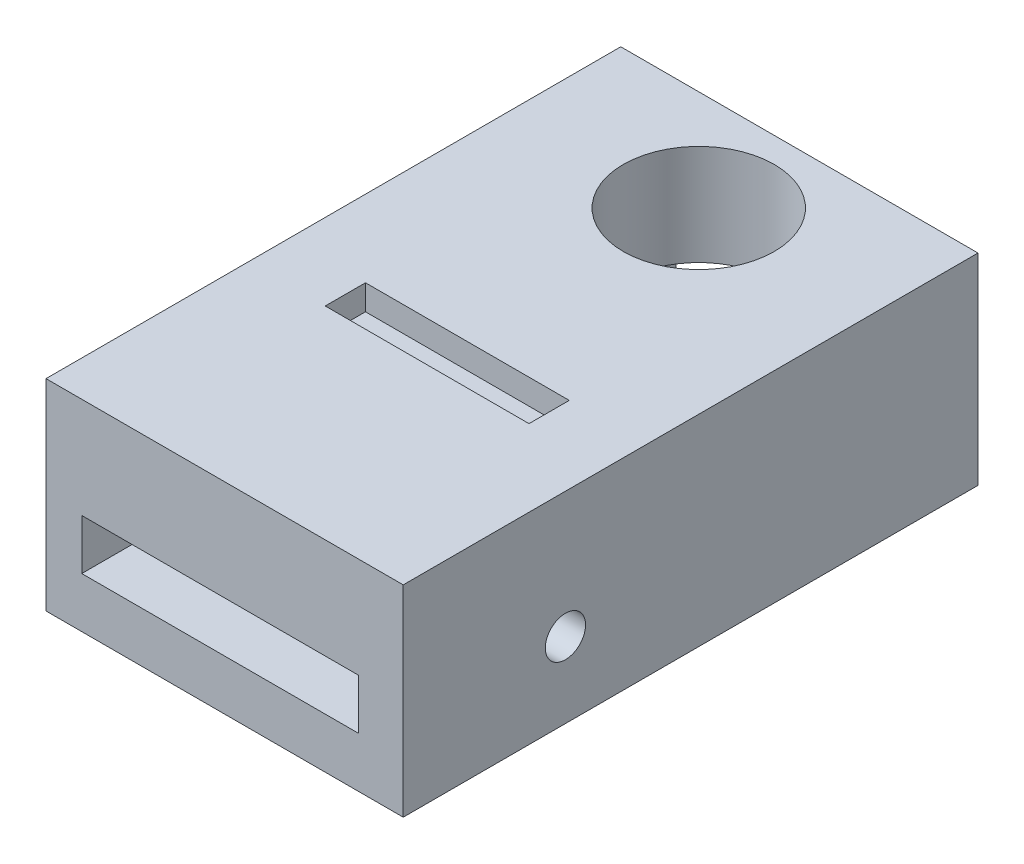
ISO-10303-21;
HEADER;
FILE_DESCRIPTION(('STEP AP214'),'2;1');
FILE_NAME('part.step','',(''),(''),'','','');
FILE_SCHEMA(('AUTOMOTIVE_DESIGN { 1 0 10303 214 1 1 1 1 }'));
ENDSEC;
DATA;
#1=APPLICATION_CONTEXT('core data for automotive mechanical design processes');
#2=APPLICATION_PROTOCOL_DEFINITION('international standard','automotive_design',2000,#1);
#3=PRODUCT_CONTEXT('',#1,'mechanical');
#4=PRODUCT('Part','Part','',(#3));
#5=PRODUCT_RELATED_PRODUCT_CATEGORY('part','',(#4));
#6=PRODUCT_DEFINITION_FORMATION('','',#4);
#7=PRODUCT_DEFINITION_CONTEXT('part definition',#1,'design');
#8=PRODUCT_DEFINITION('design','',#6,#7);
#9=PRODUCT_DEFINITION_SHAPE('','',#8);
#10=(LENGTH_UNIT() NAMED_UNIT(*) SI_UNIT(.MILLI.,.METRE.));
#11=(NAMED_UNIT(*) PLANE_ANGLE_UNIT() SI_UNIT($,.RADIAN.));
#12=(NAMED_UNIT(*) SI_UNIT($,.STERADIAN.) SOLID_ANGLE_UNIT());
#13=UNCERTAINTY_MEASURE_WITH_UNIT(LENGTH_MEASURE(1.E-05),#10,'distance_accuracy_value','');
#14=(GEOMETRIC_REPRESENTATION_CONTEXT(3) GLOBAL_UNCERTAINTY_ASSIGNED_CONTEXT((#13)) GLOBAL_UNIT_ASSIGNED_CONTEXT((#10,
#11,#12)) REPRESENTATION_CONTEXT('',''));
#15=CARTESIAN_POINT('',(0.,0.,0.));
#16=DIRECTION('',(0.,0.,1.));
#17=DIRECTION('',(1.,0.,0.));
#18=AXIS2_PLACEMENT_3D('',#15,#16,#17);
#19=CARTESIAN_POINT('',(35.5,40.,32.12));
#20=DIRECTION('',(-1.,0.,0.));
#21=DIRECTION('',(0.,0.,1.));
#22=AXIS2_PLACEMENT_3D('',#19,#20,#21);
#23=PLANE('',#22);
#24=CARTESIAN_POINT('',(35.5,15.,-0.120000000000009));
#25=DIRECTION('',(1.,0.,0.));
#26=DIRECTION('',(0.,0.,-1.));
#27=AXIS2_PLACEMENT_3D('',#24,#25,#26);
#28=CIRCLE('',#27,4.);
#29=CARTESIAN_POINT('',(35.5,15.,-4.12000000000001));
#30=VERTEX_POINT('',#29);
#31=EDGE_CURVE('E223',#30,#30,#28,.T.);
#32=ORIENTED_EDGE('',*,*,#31,.F.);
#33=EDGE_LOOP('',(#32));
#34=FACE_BOUND('',#33,.T.);
#35=DIRECTION('',(0.,0.,-1.));
#36=VECTOR('',#35,1.);
#37=CARTESIAN_POINT('',(35.5,0.,32.12));
#38=LINE('',#37,#36);
#39=CARTESIAN_POINT('',(35.5,0.,32.12));
#40=VERTEX_POINT('',#39);
#41=CARTESIAN_POINT('',(35.5,0.,-82.12));
#42=VERTEX_POINT('',#41);
#43=EDGE_CURVE('E277',#40,#42,#38,.T.);
#44=ORIENTED_EDGE('',*,*,#43,.T.);
#45=DIRECTION('',(0.,-1.,0.));
#46=VECTOR('',#45,1.);
#47=CARTESIAN_POINT('',(35.5,40.,-82.12));
#48=LINE('',#47,#46);
#49=CARTESIAN_POINT('',(35.5,40.,-82.12));
#50=VERTEX_POINT('',#49);
#51=EDGE_CURVE('E261',#50,#42,#48,.T.);
#52=ORIENTED_EDGE('',*,*,#51,.F.);
#53=DIRECTION('',(0.,0.,-1.));
#54=VECTOR('',#53,1.);
#55=CARTESIAN_POINT('',(35.5,40.,32.12));
#56=LINE('',#55,#54);
#57=CARTESIAN_POINT('',(35.5,40.,32.12));
#58=VERTEX_POINT('',#57);
#59=EDGE_CURVE('E278',#58,#50,#56,.T.);
#60=ORIENTED_EDGE('',*,*,#59,.F.);
#61=DIRECTION('',(0.,-1.,0.));
#62=VECTOR('',#61,1.);
#63=CARTESIAN_POINT('',(35.5,40.,32.12));
#64=LINE('',#63,#62);
#65=EDGE_CURVE('E41',#58,#40,#64,.T.);
#66=ORIENTED_EDGE('',*,*,#65,.T.);
#67=EDGE_LOOP('',(#44,#52,#60,#66));
#68=FACE_BOUND('',#67,.T.);
#69=ADVANCED_FACE('F33',(#34,#68),#23,.F.);
#70=CARTESIAN_POINT('',(-35.5,40.,32.12));
#71=DIRECTION('',(1.,0.,0.));
#72=DIRECTION('',(0.,0.,-1.));
#73=AXIS2_PLACEMENT_3D('',#70,#71,#72);
#74=PLANE('',#73);
#75=CARTESIAN_POINT('',(-35.5,15.,-0.119999999999995));
#76=DIRECTION('',(-1.,0.,0.));
#77=DIRECTION('',(0.,0.,1.));
#78=AXIS2_PLACEMENT_3D('',#75,#76,#77);
#79=CIRCLE('',#78,4.);
#80=CARTESIAN_POINT('',(-35.5,15.,3.88000000000001));
#81=VERTEX_POINT('',#80);
#82=EDGE_CURVE('E274',#81,#81,#79,.T.);
#83=ORIENTED_EDGE('',*,*,#82,.F.);
#84=EDGE_LOOP('',(#83));
#85=FACE_BOUND('',#84,.T.);
#86=DIRECTION('',(0.,0.,1.));
#87=VECTOR('',#86,1.);
#88=CARTESIAN_POINT('',(-35.5,0.,32.12));
#89=LINE('',#88,#87);
#90=CARTESIAN_POINT('',(-35.5,0.,-82.12));
#91=VERTEX_POINT('',#90);
#92=CARTESIAN_POINT('',(-35.5,0.,32.12));
#93=VERTEX_POINT('',#92);
#94=EDGE_CURVE('E286',#91,#93,#89,.T.);
#95=ORIENTED_EDGE('',*,*,#94,.T.);
#96=DIRECTION('',(0.,-1.,0.));
#97=VECTOR('',#96,1.);
#98=CARTESIAN_POINT('',(-35.5,40.,32.12));
#99=LINE('',#98,#97);
#100=CARTESIAN_POINT('',(-35.5,40.,32.12));
#101=VERTEX_POINT('',#100);
#102=EDGE_CURVE('E11',#101,#93,#99,.T.);
#103=ORIENTED_EDGE('',*,*,#102,.F.);
#104=DIRECTION('',(0.,0.,1.));
#105=VECTOR('',#104,1.);
#106=CARTESIAN_POINT('',(-35.5,40.,32.12));
#107=LINE('',#106,#105);
#108=CARTESIAN_POINT('',(-35.5,40.,-82.12));
#109=VERTEX_POINT('',#108);
#110=EDGE_CURVE('E280',#109,#101,#107,.T.);
#111=ORIENTED_EDGE('',*,*,#110,.F.);
#112=DIRECTION('',(0.,1.,0.));
#113=VECTOR('',#112,1.);
#114=CARTESIAN_POINT('',(-35.5,40.,-82.12));
#115=LINE('',#114,#113);
#116=EDGE_CURVE('E268',#91,#109,#115,.T.);
#117=ORIENTED_EDGE('',*,*,#116,.F.);
#118=EDGE_LOOP('',(#95,#103,#111,#117));
#119=FACE_BOUND('',#118,.T.);
#120=ADVANCED_FACE('F315',(#85,#119),#74,.F.);
#121=CARTESIAN_POINT('',(-35.5,40.,32.12));
#122=DIRECTION('',(0.,0.,-1.));
#123=DIRECTION('',(-1.,0.,0.));
#124=AXIS2_PLACEMENT_3D('',#121,#122,#123);
#125=PLANE('',#124);
#126=DIRECTION('',(-1.,0.,0.));
#127=VECTOR('',#126,1.);
#128=CARTESIAN_POINT('',(-28.3908256360522,20.,32.12));
#129=LINE('',#128,#127);
#130=CARTESIAN_POINT('',(26.6091743639478,20.,32.12));
#131=VERTEX_POINT('',#130);
#132=CARTESIAN_POINT('',(-28.3908256360522,20.,32.12));
#133=VERTEX_POINT('',#132);
#134=EDGE_CURVE('E202',#131,#133,#129,.T.);
#135=ORIENTED_EDGE('',*,*,#134,.F.);
#136=DIRECTION('',(0.,1.,0.));
#137=VECTOR('',#136,1.);
#138=CARTESIAN_POINT('',(26.6091743639478,10.,32.12));
#139=LINE('',#138,#137);
#140=CARTESIAN_POINT('',(26.6091743639478,10.,32.12));
#141=VERTEX_POINT('',#140);
#142=EDGE_CURVE('E57',#141,#131,#139,.T.);
#143=ORIENTED_EDGE('',*,*,#142,.F.);
#144=DIRECTION('',(1.,0.,0.));
#145=VECTOR('',#144,1.);
#146=CARTESIAN_POINT('',(-28.3908256360522,10.,32.12));
#147=LINE('',#146,#145);
#148=CARTESIAN_POINT('',(-28.3908256360522,10.,32.12));
#149=VERTEX_POINT('',#148);
#150=EDGE_CURVE('E191',#149,#141,#147,.T.);
#151=ORIENTED_EDGE('',*,*,#150,.F.);
#152=DIRECTION('',(0.,-1.,0.));
#153=VECTOR('',#152,1.);
#154=CARTESIAN_POINT('',(-28.3908256360522,10.,32.12));
#155=LINE('',#154,#153);
#156=EDGE_CURVE('E205',#133,#149,#155,.T.);
#157=ORIENTED_EDGE('',*,*,#156,.F.);
#158=EDGE_LOOP('',(#135,#143,#151,#157));
#159=FACE_BOUND('',#158,.T.);
#160=DIRECTION('',(1.,0.,0.));
#161=VECTOR('',#160,1.);
#162=CARTESIAN_POINT('',(-35.5,0.,32.12));
#163=LINE('',#162,#161);
#164=EDGE_CURVE('E281',#93,#40,#163,.T.);
#165=ORIENTED_EDGE('',*,*,#164,.T.);
#166=ORIENTED_EDGE('',*,*,#65,.F.);
#167=DIRECTION('',(1.,0.,0.));
#168=VECTOR('',#167,1.);
#169=CARTESIAN_POINT('',(-35.5,40.,32.12));
#170=LINE('',#169,#168);
#171=EDGE_CURVE('E283',#101,#58,#170,.T.);
#172=ORIENTED_EDGE('',*,*,#171,.F.);
#173=ORIENTED_EDGE('',*,*,#102,.T.);
#174=EDGE_LOOP('',(#165,#166,#172,#173));
#175=FACE_BOUND('',#174,.T.);
#176=ADVANCED_FACE('F320',(#159,#175),#125,.F.);
#177=CARTESIAN_POINT('',(0.,40.,0.));
#178=DIRECTION('',(0.,-1.,0.));
#179=DIRECTION('',(0.,0.,-1.));
#180=AXIS2_PLACEMENT_3D('',#177,#178,#179);
#181=PLANE('',#180);
#182=DIRECTION('',(1.,0.,0.));
#183=VECTOR('',#182,1.);
#184=CARTESIAN_POINT('',(-20.25,40.,-8.13));
#185=LINE('',#184,#183);
#186=CARTESIAN_POINT('',(-20.25,40.,-8.13));
#187=VERTEX_POINT('',#186);
#188=CARTESIAN_POINT('',(20.25,40.,-8.13));
#189=VERTEX_POINT('',#188);
#190=EDGE_CURVE('E242',#187,#189,#185,.T.);
#191=ORIENTED_EDGE('',*,*,#190,.F.);
#192=DIRECTION('',(0.,0.,1.));
#193=VECTOR('',#192,1.);
#194=CARTESIAN_POINT('',(-20.25,40.,-16.13));
#195=LINE('',#194,#193);
#196=CARTESIAN_POINT('',(-20.25,40.,-16.13));
#197=VERTEX_POINT('',#196);
#198=EDGE_CURVE('E226',#197,#187,#195,.T.);
#199=ORIENTED_EDGE('',*,*,#198,.F.);
#200=DIRECTION('',(-1.,0.,0.));
#201=VECTOR('',#200,1.);
#202=CARTESIAN_POINT('',(-20.25,40.,-16.13));
#203=LINE('',#202,#201);
#204=CARTESIAN_POINT('',(20.25,40.,-16.13));
#205=VERTEX_POINT('',#204);
#206=EDGE_CURVE('E231',#205,#197,#203,.T.);
#207=ORIENTED_EDGE('',*,*,#206,.F.);
#208=DIRECTION('',(0.,0.,-1.));
#209=VECTOR('',#208,1.);
#210=CARTESIAN_POINT('',(20.25,40.,-16.13));
#211=LINE('',#210,#209);
#212=EDGE_CURVE('E245',#189,#205,#211,.T.);
#213=ORIENTED_EDGE('',*,*,#212,.F.);
#214=EDGE_LOOP('',(#191,#199,#207,#213));
#215=FACE_BOUND('',#214,.T.);
#216=CARTESIAN_POINT('',(0.,40.,-62.12));
#217=DIRECTION('',(0.,1.,0.));
#218=DIRECTION('',(0.,0.,1.));
#219=AXIS2_PLACEMENT_3D('',#216,#217,#218);
#220=CIRCLE('',#219,15.);
#221=CARTESIAN_POINT('',(0.,40.,-47.12));
#222=VERTEX_POINT('',#221);
#223=EDGE_CURVE('E252',#222,#222,#220,.T.);
#224=ORIENTED_EDGE('',*,*,#223,.F.);
#225=EDGE_LOOP('',(#224));
#226=FACE_BOUND('',#225,.T.);
#227=ORIENTED_EDGE('',*,*,#59,.T.);
#228=DIRECTION('',(1.,0.,0.));
#229=VECTOR('',#228,1.);
#230=CARTESIAN_POINT('',(35.5,40.,-82.12));
#231=LINE('',#230,#229);
#232=EDGE_CURVE('E271',#109,#50,#231,.T.);
#233=ORIENTED_EDGE('',*,*,#232,.F.);
#234=ORIENTED_EDGE('',*,*,#110,.T.);
#235=ORIENTED_EDGE('',*,*,#171,.T.);
#236=EDGE_LOOP('',(#227,#233,#234,#235));
#237=FACE_BOUND('',#236,.T.);
#238=ADVANCED_FACE('F337',(#215,#226,#237),#181,.F.);
#239=CARTESIAN_POINT('',(0.,0.,0.));
#240=DIRECTION('',(0.,-1.,0.));
#241=DIRECTION('',(0.,0.,-1.));
#242=AXIS2_PLACEMENT_3D('',#239,#240,#241);
#243=PLANE('',#242);
#244=DIRECTION('',(0.,0.,1.));
#245=VECTOR('',#244,1.);
#246=CARTESIAN_POINT('',(26.61,0.,-82.12));
#247=LINE('',#246,#245);
#248=CARTESIAN_POINT('',(26.61,0.,-82.12));
#249=VERTEX_POINT('',#248);
#250=CARTESIAN_POINT('',(26.61,0.,-44.12));
#251=VERTEX_POINT('',#250);
#252=EDGE_CURVE('E156',#249,#251,#247,.T.);
#253=ORIENTED_EDGE('',*,*,#252,.F.);
#254=DIRECTION('',(-1.,0.,0.));
#255=VECTOR('',#254,1.);
#256=CARTESIAN_POINT('',(35.5,0.,-82.12));
#257=LINE('',#256,#255);
#258=EDGE_CURVE('E265',#42,#249,#257,.T.);
#259=ORIENTED_EDGE('',*,*,#258,.F.);
#260=ORIENTED_EDGE('',*,*,#43,.F.);
#261=ORIENTED_EDGE('',*,*,#164,.F.);
#262=ORIENTED_EDGE('',*,*,#94,.F.);
#263=CARTESIAN_POINT('',(-24.5,0.,-82.12));
#264=VERTEX_POINT('',#263);
#265=EDGE_CURVE('E264',#264,#91,#257,.T.);
#266=ORIENTED_EDGE('',*,*,#265,.F.);
#267=DIRECTION('',(0.,0.,-1.));
#268=VECTOR('',#267,1.);
#269=CARTESIAN_POINT('',(-24.5,0.,-82.12));
#270=LINE('',#269,#268);
#271=CARTESIAN_POINT('',(-24.5,0.,-44.12));
#272=VERTEX_POINT('',#271);
#273=EDGE_CURVE('E171',#272,#264,#270,.T.);
#274=ORIENTED_EDGE('',*,*,#273,.F.);
#275=DIRECTION('',(-1.,0.,0.));
#276=VECTOR('',#275,1.);
#277=CARTESIAN_POINT('',(26.61,0.,-44.12));
#278=LINE('',#277,#276);
#279=EDGE_CURVE('E173',#251,#272,#278,.T.);
#280=ORIENTED_EDGE('',*,*,#279,.F.);
#281=EDGE_LOOP('',(#253,#259,#260,#261,#262,#266,#274,#280));
#282=FACE_BOUND('',#281,.T.);
#283=ADVANCED_FACE('F331',(#282),#243,.T.);
#284=CARTESIAN_POINT('',(-25.5,15.,-0.119999999999995));
#285=DIRECTION('',(-1.,0.,0.));
#286=DIRECTION('',(0.,0.,1.));
#287=AXIS2_PLACEMENT_3D('',#284,#285,#286);
#288=CYLINDRICAL_SURFACE('',#287,4.);
#289=CARTESIAN_POINT('',(-28.3908256360522,15.,-0.119999999999995));
#290=DIRECTION('',(-1.,0.,0.));
#291=DIRECTION('',(0.,0.,1.));
#292=AXIS2_PLACEMENT_3D('',#289,#290,#291);
#293=CIRCLE('',#292,4.);
#294=CARTESIAN_POINT('',(-28.3908256360522,15.,3.88000000000001));
#295=VERTEX_POINT('',#294);
#296=EDGE_CURVE('E220',#295,#295,#293,.F.);
#297=ORIENTED_EDGE('',*,*,#296,.T.);
#298=EDGE_LOOP('',(#297));
#299=FACE_BOUND('',#298,.T.);
#300=ORIENTED_EDGE('',*,*,#82,.T.);
#301=EDGE_LOOP('',(#300));
#302=FACE_BOUND('',#301,.T.);
#303=ADVANCED_FACE('F368',(#299,#302),#288,.F.);
#304=CARTESIAN_POINT('',(0.,0.,-82.12));
#305=DIRECTION('',(0.,0.,-1.));
#306=DIRECTION('',(-1.,0.,0.));
#307=AXIS2_PLACEMENT_3D('',#304,#305,#306);
#308=PLANE('',#307);
#309=DIRECTION('',(0.,-1.,0.));
#310=VECTOR('',#309,1.);
#311=CARTESIAN_POINT('',(-24.5,10.,-82.12));
#312=LINE('',#311,#310);
#313=CARTESIAN_POINT('',(-24.5,10.,-82.12));
#314=VERTEX_POINT('',#313);
#315=EDGE_CURVE('E183',#314,#264,#312,.T.);
#316=ORIENTED_EDGE('',*,*,#315,.T.);
#317=ORIENTED_EDGE('',*,*,#265,.T.);
#318=ORIENTED_EDGE('',*,*,#116,.T.);
#319=ORIENTED_EDGE('',*,*,#232,.T.);
#320=ORIENTED_EDGE('',*,*,#51,.T.);
#321=ORIENTED_EDGE('',*,*,#258,.T.);
#322=DIRECTION('',(0.,-1.,0.));
#323=VECTOR('',#322,1.);
#324=CARTESIAN_POINT('',(26.61,10.,-82.12));
#325=LINE('',#324,#323);
#326=CARTESIAN_POINT('',(26.61,10.,-82.12));
#327=VERTEX_POINT('',#326);
#328=EDGE_CURVE('E181',#327,#249,#325,.T.);
#329=ORIENTED_EDGE('',*,*,#328,.F.);
#330=DIRECTION('',(1.,0.,0.));
#331=VECTOR('',#330,1.);
#332=CARTESIAN_POINT('',(26.61,10.,-82.12));
#333=LINE('',#332,#331);
#334=CARTESIAN_POINT('',(26.6091743639478,10.,-82.12));
#335=VERTEX_POINT('',#334);
#336=EDGE_CURVE('E161',#335,#327,#333,.T.);
#337=ORIENTED_EDGE('',*,*,#336,.F.);
#338=DIRECTION('',(0.,1.,0.));
#339=VECTOR('',#338,1.);
#340=CARTESIAN_POINT('',(26.6091743639478,10.,-82.12));
#341=LINE('',#340,#339);
#342=CARTESIAN_POINT('',(26.6091743639478,20.,-82.12));
#343=VERTEX_POINT('',#342);
#344=EDGE_CURVE('E187',#335,#343,#341,.T.);
#345=ORIENTED_EDGE('',*,*,#344,.T.);
#346=DIRECTION('',(-1.,0.,0.));
#347=VECTOR('',#346,1.);
#348=CARTESIAN_POINT('',(-28.3908256360522,20.,-82.12));
#349=LINE('',#348,#347);
#350=CARTESIAN_POINT('',(-28.3908256360522,20.,-82.12));
#351=VERTEX_POINT('',#350);
#352=EDGE_CURVE('E190',#343,#351,#349,.T.);
#353=ORIENTED_EDGE('',*,*,#352,.T.);
#354=DIRECTION('',(0.,-1.,0.));
#355=VECTOR('',#354,1.);
#356=CARTESIAN_POINT('',(-28.3908256360522,10.,-82.12));
#357=LINE('',#356,#355);
#358=CARTESIAN_POINT('',(-28.3908256360522,10.,-82.12));
#359=VERTEX_POINT('',#358);
#360=EDGE_CURVE('E194',#351,#359,#357,.T.);
#361=ORIENTED_EDGE('',*,*,#360,.T.);
#362=DIRECTION('',(1.,0.,0.));
#363=VECTOR('',#362,1.);
#364=CARTESIAN_POINT('',(-28.3908256360522,10.,-82.12));
#365=LINE('',#364,#363);
#366=EDGE_CURVE('E197',#359,#314,#365,.T.);
#367=ORIENTED_EDGE('',*,*,#366,.T.);
#368=EDGE_LOOP('',(#316,#317,#318,#319,#320,#321,#329,#337,#345,#353,#361,#367));
#369=FACE_BOUND('',#368,.T.);
#370=ADVANCED_FACE('F333',(#369),#308,.T.);
#371=CARTESIAN_POINT('',(0.,0.,-62.12));
#372=DIRECTION('',(0.,1.,0.));
#373=DIRECTION('',(0.,0.,1.));
#374=AXIS2_PLACEMENT_3D('',#371,#372,#373);
#375=CYLINDRICAL_SURFACE('',#374,15.);
#376=CARTESIAN_POINT('',(0.,20.,-62.12));
#377=DIRECTION('',(0.,1.,0.));
#378=DIRECTION('',(0.,0.,1.));
#379=AXIS2_PLACEMENT_3D('',#376,#377,#378);
#380=CIRCLE('',#379,15.);
#381=CARTESIAN_POINT('',(0.,20.,-47.12));
#382=VERTEX_POINT('',#381);
#383=EDGE_CURVE('E36',#382,#382,#380,.F.);
#384=ORIENTED_EDGE('',*,*,#383,.T.);
#385=EDGE_LOOP('',(#384));
#386=FACE_BOUND('',#385,.T.);
#387=ORIENTED_EDGE('',*,*,#223,.T.);
#388=EDGE_LOOP('',(#387));
#389=FACE_BOUND('',#388,.T.);
#390=ADVANCED_FACE('F296',(#386,#389),#375,.F.);
#391=CARTESIAN_POINT('',(-20.25,35.,-16.13));
#392=DIRECTION('',(-1.,0.,0.));
#393=DIRECTION('',(0.,0.,1.));
#394=AXIS2_PLACEMENT_3D('',#391,#392,#393);
#395=PLANE('',#394);
#396=ORIENTED_EDGE('',*,*,#198,.T.);
#397=DIRECTION('',(0.,1.,0.));
#398=VECTOR('',#397,1.);
#399=CARTESIAN_POINT('',(-20.25,35.,-8.13));
#400=LINE('',#399,#398);
#401=CARTESIAN_POINT('',(-20.25,35.,-8.13));
#402=VERTEX_POINT('',#401);
#403=EDGE_CURVE('E240',#402,#187,#400,.T.);
#404=ORIENTED_EDGE('',*,*,#403,.F.);
#405=DIRECTION('',(0.,0.,1.));
#406=VECTOR('',#405,1.);
#407=CARTESIAN_POINT('',(-20.25,35.,-16.13));
#408=LINE('',#407,#406);
#409=CARTESIAN_POINT('',(-20.25,35.,-16.13));
#410=VERTEX_POINT('',#409);
#411=EDGE_CURVE('E227',#410,#402,#408,.T.);
#412=ORIENTED_EDGE('',*,*,#411,.F.);
#413=DIRECTION('',(0.,1.,0.));
#414=VECTOR('',#413,1.);
#415=CARTESIAN_POINT('',(-20.25,35.,-16.13));
#416=LINE('',#415,#414);
#417=EDGE_CURVE('E250',#410,#197,#416,.T.);
#418=ORIENTED_EDGE('',*,*,#417,.T.);
#419=EDGE_LOOP('',(#396,#404,#412,#418));
#420=FACE_BOUND('',#419,.T.);
#421=ADVANCED_FACE('F377',(#420),#395,.F.);
#422=CARTESIAN_POINT('',(-20.25,35.,-16.13));
#423=DIRECTION('',(0.,0.,-1.));
#424=DIRECTION('',(-1.,0.,0.));
#425=AXIS2_PLACEMENT_3D('',#422,#423,#424);
#426=PLANE('',#425);
#427=ORIENTED_EDGE('',*,*,#206,.T.);
#428=ORIENTED_EDGE('',*,*,#417,.F.);
#429=DIRECTION('',(-1.,0.,0.));
#430=VECTOR('',#429,1.);
#431=CARTESIAN_POINT('',(-20.25,35.,-16.13));
#432=LINE('',#431,#430);
#433=CARTESIAN_POINT('',(20.25,35.,-16.13));
#434=VERTEX_POINT('',#433);
#435=EDGE_CURVE('E237',#434,#410,#432,.T.);
#436=ORIENTED_EDGE('',*,*,#435,.F.);
#437=DIRECTION('',(0.,1.,0.));
#438=VECTOR('',#437,1.);
#439=CARTESIAN_POINT('',(20.25,35.,-16.13));
#440=LINE('',#439,#438);
#441=EDGE_CURVE('E253',#434,#205,#440,.T.);
#442=ORIENTED_EDGE('',*,*,#441,.T.);
#443=EDGE_LOOP('',(#427,#428,#436,#442));
#444=FACE_BOUND('',#443,.T.);
#445=ADVANCED_FACE('F380',(#444),#426,.F.);
#446=CARTESIAN_POINT('',(20.25,35.,-16.13));
#447=DIRECTION('',(1.,0.,0.));
#448=DIRECTION('',(0.,0.,-1.));
#449=AXIS2_PLACEMENT_3D('',#446,#447,#448);
#450=PLANE('',#449);
#451=ORIENTED_EDGE('',*,*,#212,.T.);
#452=ORIENTED_EDGE('',*,*,#441,.F.);
#453=DIRECTION('',(0.,0.,-1.));
#454=VECTOR('',#453,1.);
#455=CARTESIAN_POINT('',(20.25,35.,-16.13));
#456=LINE('',#455,#454);
#457=CARTESIAN_POINT('',(20.25,35.,-8.13));
#458=VERTEX_POINT('',#457);
#459=EDGE_CURVE('E234',#458,#434,#456,.T.);
#460=ORIENTED_EDGE('',*,*,#459,.F.);
#461=DIRECTION('',(0.,1.,0.));
#462=VECTOR('',#461,1.);
#463=CARTESIAN_POINT('',(20.25,35.,-8.13));
#464=LINE('',#463,#462);
#465=EDGE_CURVE('E255',#458,#189,#464,.T.);
#466=ORIENTED_EDGE('',*,*,#465,.T.);
#467=EDGE_LOOP('',(#451,#452,#460,#466));
#468=FACE_BOUND('',#467,.T.);
#469=ADVANCED_FACE('F386',(#468),#450,.F.);
#470=CARTESIAN_POINT('',(-20.25,35.,-8.13));
#471=DIRECTION('',(0.,0.,1.));
#472=DIRECTION('',(1.,0.,0.));
#473=AXIS2_PLACEMENT_3D('',#470,#471,#472);
#474=PLANE('',#473);
#475=ORIENTED_EDGE('',*,*,#190,.T.);
#476=ORIENTED_EDGE('',*,*,#465,.F.);
#477=DIRECTION('',(1.,0.,0.));
#478=VECTOR('',#477,1.);
#479=CARTESIAN_POINT('',(-20.25,35.,-8.13));
#480=LINE('',#479,#478);
#481=EDGE_CURVE('E230',#402,#458,#480,.T.);
#482=ORIENTED_EDGE('',*,*,#481,.F.);
#483=ORIENTED_EDGE('',*,*,#403,.T.);
#484=EDGE_LOOP('',(#475,#476,#482,#483));
#485=FACE_BOUND('',#484,.T.);
#486=ADVANCED_FACE('F382',(#485),#474,.F.);
#487=CARTESIAN_POINT('',(0.,35.,0.));
#488=DIRECTION('',(0.,1.,0.));
#489=DIRECTION('',(0.,0.,1.));
#490=AXIS2_PLACEMENT_3D('',#487,#488,#489);
#491=PLANE('',#490);
#492=ORIENTED_EDGE('',*,*,#411,.T.);
#493=ORIENTED_EDGE('',*,*,#481,.T.);
#494=ORIENTED_EDGE('',*,*,#459,.T.);
#495=ORIENTED_EDGE('',*,*,#435,.T.);
#496=EDGE_LOOP('',(#492,#493,#494,#495));
#497=FACE_BOUND('',#496,.T.);
#498=ADVANCED_FACE('F385',(#497),#491,.T.);
#499=CARTESIAN_POINT('',(25.5,15.,-0.120000000000009));
#500=DIRECTION('',(1.,0.,0.));
#501=DIRECTION('',(0.,0.,-1.));
#502=AXIS2_PLACEMENT_3D('',#499,#500,#501);
#503=CYLINDRICAL_SURFACE('',#502,4.);
#504=CARTESIAN_POINT('',(26.6091743639478,15.,-0.120000000000009));
#505=DIRECTION('',(1.,0.,0.));
#506=DIRECTION('',(0.,0.,-1.));
#507=AXIS2_PLACEMENT_3D('',#504,#505,#506);
#508=CIRCLE('',#507,4.);
#509=CARTESIAN_POINT('',(26.6091743639478,15.,-4.12000000000001));
#510=VERTEX_POINT('',#509);
#511=EDGE_CURVE('E213',#510,#510,#508,.F.);
#512=ORIENTED_EDGE('',*,*,#511,.T.);
#513=EDGE_LOOP('',(#512));
#514=FACE_BOUND('',#513,.T.);
#515=ORIENTED_EDGE('',*,*,#31,.T.);
#516=EDGE_LOOP('',(#515));
#517=FACE_BOUND('',#516,.T.);
#518=ADVANCED_FACE('F396',(#514,#517),#503,.F.);
#519=CARTESIAN_POINT('',(-28.3908256360522,10.,-82.12));
#520=DIRECTION('',(-1.,0.,0.));
#521=DIRECTION('',(0.,0.,1.));
#522=AXIS2_PLACEMENT_3D('',#519,#520,#521);
#523=PLANE('',#522);
#524=ORIENTED_EDGE('',*,*,#156,.T.);
#525=DIRECTION('',(0.,0.,1.));
#526=VECTOR('',#525,1.);
#527=CARTESIAN_POINT('',(-28.3908256360522,10.,-82.12));
#528=LINE('',#527,#526);
#529=EDGE_CURVE('E215',#359,#149,#528,.T.);
#530=ORIENTED_EDGE('',*,*,#529,.F.);
#531=ORIENTED_EDGE('',*,*,#360,.F.);
#532=DIRECTION('',(0.,0.,1.));
#533=VECTOR('',#532,1.);
#534=CARTESIAN_POINT('',(-28.3908256360522,20.,-82.12));
#535=LINE('',#534,#533);
#536=EDGE_CURVE('E217',#351,#133,#535,.T.);
#537=ORIENTED_EDGE('',*,*,#536,.T.);
#538=EDGE_LOOP('',(#524,#530,#531,#537));
#539=FACE_BOUND('',#538,.T.);
#540=ORIENTED_EDGE('',*,*,#296,.F.);
#541=EDGE_LOOP('',(#540));
#542=FACE_BOUND('',#541,.T.);
#543=ADVANCED_FACE('F310',(#539,#542),#523,.F.);
#544=CARTESIAN_POINT('',(-28.3908256360522,10.,-82.12));
#545=DIRECTION('',(0.,-1.,0.));
#546=DIRECTION('',(0.,0.,-1.));
#547=AXIS2_PLACEMENT_3D('',#544,#545,#546);
#548=PLANE('',#547);
#549=DIRECTION('',(-1.,0.,0.));
#550=VECTOR('',#549,1.);
#551=CARTESIAN_POINT('',(26.61,10.,-44.12));
#552=LINE('',#551,#550);
#553=CARTESIAN_POINT('',(26.6091743639478,10.,-44.12));
#554=VERTEX_POINT('',#553);
#555=CARTESIAN_POINT('',(-24.5,10.,-44.12));
#556=VERTEX_POINT('',#555);
#557=EDGE_CURVE('E165',#554,#556,#552,.T.);
#558=ORIENTED_EDGE('',*,*,#557,.T.);
#559=DIRECTION('',(0.,0.,-1.));
#560=VECTOR('',#559,1.);
#561=CARTESIAN_POINT('',(-24.5,10.,-82.12));
#562=LINE('',#561,#560);
#563=EDGE_CURVE('E167',#556,#314,#562,.T.);
#564=ORIENTED_EDGE('',*,*,#563,.T.);
#565=ORIENTED_EDGE('',*,*,#366,.F.);
#566=ORIENTED_EDGE('',*,*,#529,.T.);
#567=ORIENTED_EDGE('',*,*,#150,.T.);
#568=DIRECTION('',(0.,0.,1.));
#569=VECTOR('',#568,1.);
#570=CARTESIAN_POINT('',(26.6091743639478,10.,-82.12));
#571=LINE('',#570,#569);
#572=EDGE_CURVE('E214',#554,#141,#571,.T.);
#573=ORIENTED_EDGE('',*,*,#572,.F.);
#574=EDGE_LOOP('',(#558,#564,#565,#566,#567,#573));
#575=FACE_BOUND('',#574,.T.);
#576=ADVANCED_FACE('F302',(#575),#548,.F.);
#577=CARTESIAN_POINT('',(-28.3908256360522,20.,-82.12));
#578=DIRECTION('',(0.,1.,0.));
#579=DIRECTION('',(0.,0.,1.));
#580=AXIS2_PLACEMENT_3D('',#577,#578,#579);
#581=PLANE('',#580);
#582=ORIENTED_EDGE('',*,*,#134,.T.);
#583=ORIENTED_EDGE('',*,*,#536,.F.);
#584=ORIENTED_EDGE('',*,*,#352,.F.);
#585=DIRECTION('',(0.,0.,1.));
#586=VECTOR('',#585,1.);
#587=CARTESIAN_POINT('',(26.6091743639478,20.,-82.12));
#588=LINE('',#587,#586);
#589=EDGE_CURVE('E200',#343,#131,#588,.T.);
#590=ORIENTED_EDGE('',*,*,#589,.T.);
#591=EDGE_LOOP('',(#582,#583,#584,#590));
#592=FACE_BOUND('',#591,.T.);
#593=ORIENTED_EDGE('',*,*,#383,.F.);
#594=EDGE_LOOP('',(#593));
#595=FACE_BOUND('',#594,.T.);
#596=ADVANCED_FACE('F299',(#592,#595),#581,.F.);
#597=CARTESIAN_POINT('',(26.6091743639478,10.,-82.12));
#598=DIRECTION('',(1.,0.,0.));
#599=DIRECTION('',(0.,0.,-1.));
#600=AXIS2_PLACEMENT_3D('',#597,#598,#599);
#601=PLANE('',#600);
#602=ORIENTED_EDGE('',*,*,#142,.T.);
#603=ORIENTED_EDGE('',*,*,#589,.F.);
#604=ORIENTED_EDGE('',*,*,#344,.F.);
#605=EDGE_CURVE('E210',#335,#554,#571,.T.);
#606=ORIENTED_EDGE('',*,*,#605,.T.);
#607=ORIENTED_EDGE('',*,*,#572,.T.);
#608=EDGE_LOOP('',(#602,#603,#604,#606,#607));
#609=FACE_BOUND('',#608,.T.);
#610=ORIENTED_EDGE('',*,*,#511,.F.);
#611=EDGE_LOOP('',(#610));
#612=FACE_BOUND('',#611,.T.);
#613=ADVANCED_FACE('F301',(#609,#612),#601,.F.);
#614=CARTESIAN_POINT('',(0.,10.,0.));
#615=DIRECTION('',(0.,-1.,0.));
#616=DIRECTION('',(0.,0.,-1.));
#617=AXIS2_PLACEMENT_3D('',#614,#615,#616);
#618=PLANE('',#617);
#619=ORIENTED_EDGE('',*,*,#605,.F.);
#620=ORIENTED_EDGE('',*,*,#336,.T.);
#621=DIRECTION('',(0.,0.,1.));
#622=VECTOR('',#621,1.);
#623=CARTESIAN_POINT('',(26.61,10.,-82.12));
#624=LINE('',#623,#622);
#625=CARTESIAN_POINT('',(26.61,10.,-44.12));
#626=VERTEX_POINT('',#625);
#627=EDGE_CURVE('E153',#327,#626,#624,.T.);
#628=ORIENTED_EDGE('',*,*,#627,.T.);
#629=EDGE_CURVE('E49',#626,#554,#552,.T.);
#630=ORIENTED_EDGE('',*,*,#629,.T.);
#631=EDGE_LOOP('',(#619,#620,#628,#630));
#632=FACE_BOUND('',#631,.T.);
#633=ADVANCED_FACE('F169',(#632),#618,.T.);
#634=CARTESIAN_POINT('',(26.61,10.,-82.12));
#635=DIRECTION('',(1.,0.,0.));
#636=DIRECTION('',(0.,0.,-1.));
#637=AXIS2_PLACEMENT_3D('',#634,#635,#636);
#638=PLANE('',#637);
#639=ORIENTED_EDGE('',*,*,#252,.T.);
#640=DIRECTION('',(0.,-1.,0.));
#641=VECTOR('',#640,1.);
#642=CARTESIAN_POINT('',(26.61,10.,-44.12));
#643=LINE('',#642,#641);
#644=EDGE_CURVE('E151',#626,#251,#643,.T.);
#645=ORIENTED_EDGE('',*,*,#644,.F.);
#646=ORIENTED_EDGE('',*,*,#627,.F.);
#647=ORIENTED_EDGE('',*,*,#328,.T.);
#648=EDGE_LOOP('',(#639,#645,#646,#647));
#649=FACE_BOUND('',#648,.T.);
#650=ADVANCED_FACE('F152',(#649),#638,.F.);
#651=CARTESIAN_POINT('',(-24.5,10.,-82.12));
#652=DIRECTION('',(-1.,0.,0.));
#653=DIRECTION('',(0.,0.,1.));
#654=AXIS2_PLACEMENT_3D('',#651,#652,#653);
#655=PLANE('',#654);
#656=ORIENTED_EDGE('',*,*,#273,.T.);
#657=ORIENTED_EDGE('',*,*,#315,.F.);
#658=ORIENTED_EDGE('',*,*,#563,.F.);
#659=DIRECTION('',(0.,-1.,0.));
#660=VECTOR('',#659,1.);
#661=CARTESIAN_POINT('',(-24.5,10.,-44.12));
#662=LINE('',#661,#660);
#663=EDGE_CURVE('E160',#556,#272,#662,.T.);
#664=ORIENTED_EDGE('',*,*,#663,.T.);
#665=EDGE_LOOP('',(#656,#657,#658,#664));
#666=FACE_BOUND('',#665,.T.);
#667=ADVANCED_FACE('F348',(#666),#655,.F.);
#668=CARTESIAN_POINT('',(26.61,10.,-44.12));
#669=DIRECTION('',(0.,0.,1.));
#670=DIRECTION('',(1.,0.,0.));
#671=AXIS2_PLACEMENT_3D('',#668,#669,#670);
#672=PLANE('',#671);
#673=ORIENTED_EDGE('',*,*,#279,.T.);
#674=ORIENTED_EDGE('',*,*,#663,.F.);
#675=ORIENTED_EDGE('',*,*,#557,.F.);
#676=ORIENTED_EDGE('',*,*,#629,.F.);
#677=ORIENTED_EDGE('',*,*,#644,.T.);
#678=EDGE_LOOP('',(#673,#674,#675,#676,#677));
#679=FACE_BOUND('',#678,.T.);
#680=ADVANCED_FACE('F163',(#679),#672,.F.);
#681=CLOSED_SHELL('',(#69,#120,#176,#238,#283,#303,#370,#390,#421,#445,#469,#486,#498,#518,#543,
#576,#596,#613,#633,#650,#667,#680));
#682=MANIFOLD_SOLID_BREP('B2',#681);
#683=ADVANCED_BREP_SHAPE_REPRESENTATION('',(#18,#682),#14);
#684=SHAPE_DEFINITION_REPRESENTATION(#9,#683);
ENDSEC;
END-ISO-10303-21;
